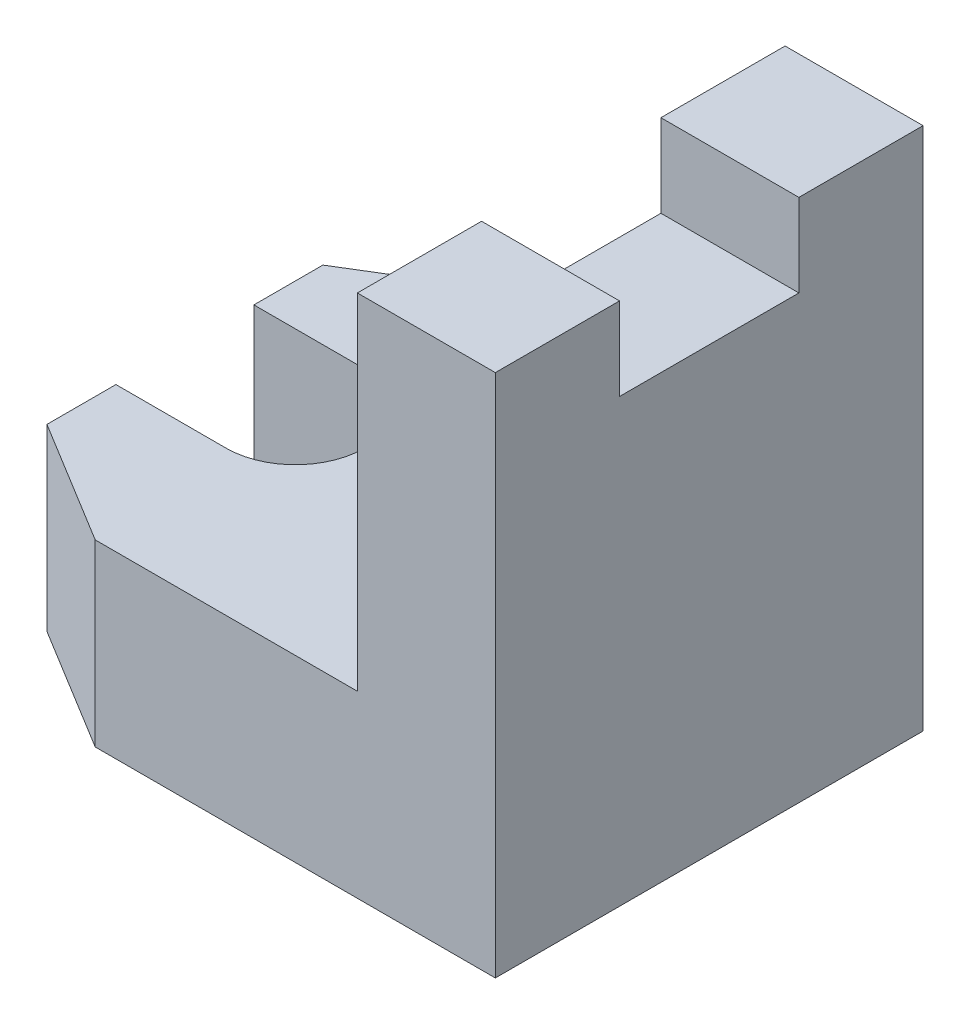
ISO-10303-21;
HEADER;
FILE_DESCRIPTION(('STEP AP214'),'2;1');
FILE_NAME('part.step','',(''),(''),'','','');
FILE_SCHEMA(('AUTOMOTIVE_DESIGN { 1 0 10303 214 1 1 1 1 }'));
ENDSEC;
DATA;
#1=APPLICATION_CONTEXT('core data for automotive mechanical design processes');
#2=APPLICATION_PROTOCOL_DEFINITION('international standard','automotive_design',2000,#1);
#3=PRODUCT_CONTEXT('',#1,'mechanical');
#4=PRODUCT('Part','Part','',(#3));
#5=PRODUCT_RELATED_PRODUCT_CATEGORY('part','',(#4));
#6=PRODUCT_DEFINITION_FORMATION('','',#4);
#7=PRODUCT_DEFINITION_CONTEXT('part definition',#1,'design');
#8=PRODUCT_DEFINITION('design','',#6,#7);
#9=PRODUCT_DEFINITION_SHAPE('','',#8);
#10=(LENGTH_UNIT() NAMED_UNIT(*) SI_UNIT(.MILLI.,.METRE.));
#11=(NAMED_UNIT(*) PLANE_ANGLE_UNIT() SI_UNIT($,.RADIAN.));
#12=(NAMED_UNIT(*) SI_UNIT($,.STERADIAN.) SOLID_ANGLE_UNIT());
#13=UNCERTAINTY_MEASURE_WITH_UNIT(LENGTH_MEASURE(1.E-05),#10,'distance_accuracy_value','');
#14=(GEOMETRIC_REPRESENTATION_CONTEXT(3) GLOBAL_UNCERTAINTY_ASSIGNED_CONTEXT((#13)) GLOBAL_UNIT_ASSIGNED_CONTEXT((#10,
#11,#12)) REPRESENTATION_CONTEXT('',''));
#15=CARTESIAN_POINT('',(0.,0.,0.));
#16=DIRECTION('',(0.,0.,1.));
#17=DIRECTION('',(1.,0.,0.));
#18=AXIS2_PLACEMENT_3D('',#15,#16,#17);
#19=CARTESIAN_POINT('',(0.,38.,0.));
#20=DIRECTION('',(0.,-1.,0.));
#21=DIRECTION('',(0.,0.,-1.));
#22=AXIS2_PLACEMENT_3D('',#19,#20,#21);
#23=PLANE('',#22);
#24=DIRECTION('',(0.,0.,-1.));
#25=VECTOR('',#24,1.);
#26=CARTESIAN_POINT('',(30.,38.,-15.5));
#27=LINE('',#26,#25);
#28=CARTESIAN_POINT('',(30.,38.,15.5));
#29=VERTEX_POINT('',#28);
#30=CARTESIAN_POINT('',(30.,38.,6.5));
#31=VERTEX_POINT('',#30);
#32=EDGE_CURVE('E191',#29,#31,#27,.T.);
#33=ORIENTED_EDGE('',*,*,#32,.T.);
#34=DIRECTION('',(1.,0.,0.));
#35=VECTOR('',#34,1.);
#36=CARTESIAN_POINT('',(20.,38.,6.5));
#37=LINE('',#36,#35);
#38=CARTESIAN_POINT('',(20.,38.,6.5));
#39=VERTEX_POINT('',#38);
#40=EDGE_CURVE('E176',#39,#31,#37,.T.);
#41=ORIENTED_EDGE('',*,*,#40,.F.);
#42=DIRECTION('',(0.,0.,1.));
#43=VECTOR('',#42,1.);
#44=CARTESIAN_POINT('',(20.,38.,-15.5));
#45=LINE('',#44,#43);
#46=CARTESIAN_POINT('',(20.,38.,15.5));
#47=VERTEX_POINT('',#46);
#48=EDGE_CURVE('E198',#39,#47,#45,.T.);
#49=ORIENTED_EDGE('',*,*,#48,.T.);
#50=DIRECTION('',(1.,0.,0.));
#51=VECTOR('',#50,1.);
#52=CARTESIAN_POINT('',(30.,38.,15.5));
#53=LINE('',#52,#51);
#54=EDGE_CURVE('E203',#47,#29,#53,.T.);
#55=ORIENTED_EDGE('',*,*,#54,.T.);
#56=EDGE_LOOP('',(#33,#41,#49,#55));
#57=FACE_BOUND('',#56,.T.);
#58=ADVANCED_FACE('F45',(#57),#23,.F.);
#59=CARTESIAN_POINT('',(0.,13.,0.));
#60=DIRECTION('',(0.,-1.,0.));
#61=DIRECTION('',(0.,0.,-1.));
#62=AXIS2_PLACEMENT_3D('',#59,#60,#61);
#63=CYLINDRICAL_SURFACE('',#62,5.);
#64=CARTESIAN_POINT('',(0.,0.,0.));
#65=DIRECTION('',(0.,-1.,0.));
#66=DIRECTION('',(0.,0.,1.));
#67=AXIS2_PLACEMENT_3D('',#64,#65,#66);
#68=CIRCLE('',#67,5.);
#69=CARTESIAN_POINT('',(0.,0.,-5.));
#70=VERTEX_POINT('',#69);
#71=CARTESIAN_POINT('',(0.,0.,5.));
#72=VERTEX_POINT('',#71);
#73=EDGE_CURVE('E218',#70,#72,#68,.T.);
#74=ORIENTED_EDGE('',*,*,#73,.T.);
#75=DIRECTION('',(0.,-1.,0.));
#76=VECTOR('',#75,1.);
#77=CARTESIAN_POINT('',(0.,13.,5.));
#78=LINE('',#77,#76);
#79=CARTESIAN_POINT('',(0.,13.,5.));
#80=VERTEX_POINT('',#79);
#81=EDGE_CURVE('E11',#80,#72,#78,.T.);
#82=ORIENTED_EDGE('',*,*,#81,.F.);
#83=CARTESIAN_POINT('',(0.,13.,0.));
#84=DIRECTION('',(0.,-1.,0.));
#85=DIRECTION('',(0.,0.,1.));
#86=AXIS2_PLACEMENT_3D('',#83,#84,#85);
#87=CIRCLE('',#86,5.);
#88=CARTESIAN_POINT('',(0.,13.,-5.));
#89=VERTEX_POINT('',#88);
#90=EDGE_CURVE('E219',#89,#80,#87,.T.);
#91=ORIENTED_EDGE('',*,*,#90,.F.);
#92=DIRECTION('',(0.,-1.,0.));
#93=VECTOR('',#92,1.);
#94=CARTESIAN_POINT('',(0.,13.,-5.));
#95=LINE('',#94,#93);
#96=EDGE_CURVE('E248',#89,#70,#95,.T.);
#97=ORIENTED_EDGE('',*,*,#96,.T.);
#98=EDGE_LOOP('',(#74,#82,#91,#97));
#99=FACE_BOUND('',#98,.T.);
#100=ADVANCED_FACE('F47',(#99),#63,.F.);
#101=CARTESIAN_POINT('',(0.,13.,5.));
#102=DIRECTION('',(0.,0.,1.));
#103=DIRECTION('',(1.,0.,0.));
#104=AXIS2_PLACEMENT_3D('',#101,#102,#103);
#105=PLANE('',#104);
#106=DIRECTION('',(-1.,0.,0.));
#107=VECTOR('',#106,1.);
#108=CARTESIAN_POINT('',(0.,0.,5.));
#109=LINE('',#108,#107);
#110=CARTESIAN_POINT('',(-8.,0.,5.));
#111=VERTEX_POINT('',#110);
#112=EDGE_CURVE('E252',#72,#111,#109,.T.);
#113=ORIENTED_EDGE('',*,*,#112,.T.);
#114=DIRECTION('',(0.,-1.,0.));
#115=VECTOR('',#114,1.);
#116=CARTESIAN_POINT('',(-8.,13.,5.));
#117=LINE('',#116,#115);
#118=CARTESIAN_POINT('',(-8.,13.,5.));
#119=VERTEX_POINT('',#118);
#120=EDGE_CURVE('E54',#119,#111,#117,.T.);
#121=ORIENTED_EDGE('',*,*,#120,.F.);
#122=DIRECTION('',(-1.,0.,0.));
#123=VECTOR('',#122,1.);
#124=CARTESIAN_POINT('',(0.,13.,5.));
#125=LINE('',#124,#123);
#126=EDGE_CURVE('E223',#80,#119,#125,.T.);
#127=ORIENTED_EDGE('',*,*,#126,.F.);
#128=ORIENTED_EDGE('',*,*,#81,.T.);
#129=EDGE_LOOP('',(#113,#121,#127,#128));
#130=FACE_BOUND('',#129,.T.);
#131=ADVANCED_FACE('F360',(#130),#105,.F.);
#132=CARTESIAN_POINT('',(-8.,13.,5.));
#133=DIRECTION('',(1.,0.,0.));
#134=DIRECTION('',(0.,0.,-1.));
#135=AXIS2_PLACEMENT_3D('',#132,#133,#134);
#136=PLANE('',#135);
#137=DIRECTION('',(0.,0.,1.));
#138=VECTOR('',#137,1.);
#139=CARTESIAN_POINT('',(-8.,0.,5.));
#140=LINE('',#139,#138);
#141=CARTESIAN_POINT('',(-8.00000000000001,0.,10.));
#142=VERTEX_POINT('',#141);
#143=EDGE_CURVE('E255',#111,#142,#140,.T.);
#144=ORIENTED_EDGE('',*,*,#143,.T.);
#145=DIRECTION('',(0.,-1.,0.));
#146=VECTOR('',#145,1.);
#147=CARTESIAN_POINT('',(-8.00000000000001,13.,10.));
#148=LINE('',#147,#146);
#149=CARTESIAN_POINT('',(-8.00000000000001,13.,10.));
#150=VERTEX_POINT('',#149);
#151=EDGE_CURVE('E305',#150,#142,#148,.T.);
#152=ORIENTED_EDGE('',*,*,#151,.F.);
#153=DIRECTION('',(0.,0.,1.));
#154=VECTOR('',#153,1.);
#155=CARTESIAN_POINT('',(-8.,13.,5.));
#156=LINE('',#155,#154);
#157=EDGE_CURVE('E227',#119,#150,#156,.T.);
#158=ORIENTED_EDGE('',*,*,#157,.F.);
#159=ORIENTED_EDGE('',*,*,#120,.T.);
#160=EDGE_LOOP('',(#144,#152,#158,#159));
#161=FACE_BOUND('',#160,.T.);
#162=ADVANCED_FACE('F314',(#161),#136,.F.);
#163=CARTESIAN_POINT('',(-8.00000000000001,13.,10.));
#164=DIRECTION('',(0.521450009453975,0.,-0.853281833651959));
#165=DIRECTION('',(-0.853281833651959,0.,-0.521450009453975));
#166=AXIS2_PLACEMENT_3D('',#163,#164,#165);
#167=PLANE('',#166);
#168=DIRECTION('',(0.853281833651959,0.,0.521450009453975));
#169=VECTOR('',#168,1.);
#170=CARTESIAN_POINT('',(-8.00000000000001,0.,10.));
#171=LINE('',#170,#169);
#172=CARTESIAN_POINT('',(0.999999999999997,0.,15.5));
#173=VERTEX_POINT('',#172);
#174=EDGE_CURVE('E258',#142,#173,#171,.T.);
#175=ORIENTED_EDGE('',*,*,#174,.T.);
#176=DIRECTION('',(0.,-1.,0.));
#177=VECTOR('',#176,1.);
#178=CARTESIAN_POINT('',(0.999999999999997,13.,15.5));
#179=LINE('',#178,#177);
#180=CARTESIAN_POINT('',(0.999999999999997,13.,15.5));
#181=VERTEX_POINT('',#180);
#182=EDGE_CURVE('E301',#181,#173,#179,.T.);
#183=ORIENTED_EDGE('',*,*,#182,.F.);
#184=DIRECTION('',(0.853281833651959,0.,0.521450009453975));
#185=VECTOR('',#184,1.);
#186=CARTESIAN_POINT('',(-8.00000000000001,13.,10.));
#187=LINE('',#186,#185);
#188=EDGE_CURVE('E230',#150,#181,#187,.T.);
#189=ORIENTED_EDGE('',*,*,#188,.F.);
#190=ORIENTED_EDGE('',*,*,#151,.T.);
#191=EDGE_LOOP('',(#175,#183,#189,#190));
#192=FACE_BOUND('',#191,.T.);
#193=ADVANCED_FACE('F325',(#192),#167,.F.);
#194=CARTESIAN_POINT('',(0.999999999999997,13.,15.5));
#195=DIRECTION('',(0.,0.,-1.));
#196=DIRECTION('',(-1.,0.,0.));
#197=AXIS2_PLACEMENT_3D('',#194,#195,#196);
#198=PLANE('',#197);
#199=DIRECTION('',(1.,0.,0.));
#200=VECTOR('',#199,1.);
#201=CARTESIAN_POINT('',(0.999999999999997,0.,15.5));
#202=LINE('',#201,#200);
#203=CARTESIAN_POINT('',(30.,0.,15.5));
#204=VERTEX_POINT('',#203);
#205=EDGE_CURVE('E261',#173,#204,#202,.T.);
#206=ORIENTED_EDGE('',*,*,#205,.T.);
#207=DIRECTION('',(0.,-1.,0.));
#208=VECTOR('',#207,1.);
#209=CARTESIAN_POINT('',(30.,13.,15.5));
#210=LINE('',#209,#208);
#211=EDGE_CURVE('E297',#29,#204,#210,.T.);
#212=ORIENTED_EDGE('',*,*,#211,.F.);
#213=ORIENTED_EDGE('',*,*,#54,.F.);
#214=DIRECTION('',(0.,-1.,0.));
#215=VECTOR('',#214,1.);
#216=CARTESIAN_POINT('',(20.,38.,15.5));
#217=LINE('',#216,#215);
#218=CARTESIAN_POINT('',(20.,13.,15.5));
#219=VERTEX_POINT('',#218);
#220=EDGE_CURVE('E207',#47,#219,#217,.T.);
#221=ORIENTED_EDGE('',*,*,#220,.T.);
#222=DIRECTION('',(1.,0.,0.));
#223=VECTOR('',#222,1.);
#224=CARTESIAN_POINT('',(0.999999999999997,13.,15.5));
#225=LINE('',#224,#223);
#226=EDGE_CURVE('E233',#181,#219,#225,.T.);
#227=ORIENTED_EDGE('',*,*,#226,.F.);
#228=ORIENTED_EDGE('',*,*,#182,.T.);
#229=EDGE_LOOP('',(#206,#212,#213,#221,#227,#228));
#230=FACE_BOUND('',#229,.T.);
#231=ADVANCED_FACE('F329',(#230),#198,.F.);
#232=CARTESIAN_POINT('',(30.,13.,-15.5));
#233=DIRECTION('',(-1.,0.,0.));
#234=DIRECTION('',(0.,0.,1.));
#235=AXIS2_PLACEMENT_3D('',#232,#233,#234);
#236=PLANE('',#235);
#237=DIRECTION('',(0.,0.,-1.));
#238=VECTOR('',#237,1.);
#239=CARTESIAN_POINT('',(30.,32.,6.5));
#240=LINE('',#239,#238);
#241=CARTESIAN_POINT('',(30.,32.,6.5));
#242=VERTEX_POINT('',#241);
#243=CARTESIAN_POINT('',(30.,32.,-6.5));
#244=VERTEX_POINT('',#243);
#245=EDGE_CURVE('E166',#242,#244,#240,.T.);
#246=ORIENTED_EDGE('',*,*,#245,.F.);
#247=DIRECTION('',(0.,1.,0.));
#248=VECTOR('',#247,1.);
#249=CARTESIAN_POINT('',(30.,32.,6.5));
#250=LINE('',#249,#248);
#251=EDGE_CURVE('E210',#242,#31,#250,.T.);
#252=ORIENTED_EDGE('',*,*,#251,.T.);
#253=ORIENTED_EDGE('',*,*,#32,.F.);
#254=ORIENTED_EDGE('',*,*,#211,.T.);
#255=DIRECTION('',(0.,0.,-1.));
#256=VECTOR('',#255,1.);
#257=CARTESIAN_POINT('',(30.,0.,-15.5));
#258=LINE('',#257,#256);
#259=CARTESIAN_POINT('',(30.,0.,-15.5));
#260=VERTEX_POINT('',#259);
#261=EDGE_CURVE('E264',#204,#260,#258,.T.);
#262=ORIENTED_EDGE('',*,*,#261,.T.);
#263=DIRECTION('',(0.,-1.,0.));
#264=VECTOR('',#263,1.);
#265=CARTESIAN_POINT('',(30.,13.,-15.5));
#266=LINE('',#265,#264);
#267=CARTESIAN_POINT('',(30.,38.,-15.5));
#268=VERTEX_POINT('',#267);
#269=EDGE_CURVE('E293',#268,#260,#266,.T.);
#270=ORIENTED_EDGE('',*,*,#269,.F.);
#271=CARTESIAN_POINT('',(30.,38.,-6.5));
#272=VERTEX_POINT('',#271);
#273=EDGE_CURVE('E181',#272,#268,#27,.T.);
#274=ORIENTED_EDGE('',*,*,#273,.F.);
#275=DIRECTION('',(0.,1.,0.));
#276=VECTOR('',#275,1.);
#277=CARTESIAN_POINT('',(30.,32.,-6.5));
#278=LINE('',#277,#276);
#279=EDGE_CURVE('E61',#244,#272,#278,.T.);
#280=ORIENTED_EDGE('',*,*,#279,.F.);
#281=EDGE_LOOP('',(#246,#252,#253,#254,#262,#270,#274,#280));
#282=FACE_BOUND('',#281,.T.);
#283=ADVANCED_FACE('F179',(#282),#236,.F.);
#284=CARTESIAN_POINT('',(0.999999999999997,13.,-15.5));
#285=DIRECTION('',(0.,0.,1.));
#286=DIRECTION('',(1.,0.,0.));
#287=AXIS2_PLACEMENT_3D('',#284,#285,#286);
#288=PLANE('',#287);
#289=DIRECTION('',(-1.,0.,0.));
#290=VECTOR('',#289,1.);
#291=CARTESIAN_POINT('',(0.999999999999997,0.,-15.5));
#292=LINE('',#291,#290);
#293=CARTESIAN_POINT('',(0.999999999999997,0.,-15.5));
#294=VERTEX_POINT('',#293);
#295=EDGE_CURVE('E267',#260,#294,#292,.T.);
#296=ORIENTED_EDGE('',*,*,#295,.T.);
#297=DIRECTION('',(0.,-1.,0.));
#298=VECTOR('',#297,1.);
#299=CARTESIAN_POINT('',(0.999999999999997,13.,-15.5));
#300=LINE('',#299,#298);
#301=CARTESIAN_POINT('',(0.999999999999997,13.,-15.5));
#302=VERTEX_POINT('',#301);
#303=EDGE_CURVE('E289',#302,#294,#300,.T.);
#304=ORIENTED_EDGE('',*,*,#303,.F.);
#305=DIRECTION('',(-1.,0.,0.));
#306=VECTOR('',#305,1.);
#307=CARTESIAN_POINT('',(0.999999999999997,13.,-15.5));
#308=LINE('',#307,#306);
#309=CARTESIAN_POINT('',(20.,13.,-15.5));
#310=VERTEX_POINT('',#309);
#311=EDGE_CURVE('E236',#310,#302,#308,.T.);
#312=ORIENTED_EDGE('',*,*,#311,.F.);
#313=DIRECTION('',(0.,-1.,0.));
#314=VECTOR('',#313,1.);
#315=CARTESIAN_POINT('',(20.,38.,-15.5));
#316=LINE('',#315,#314);
#317=CARTESIAN_POINT('',(20.,38.,-15.5));
#318=VERTEX_POINT('',#317);
#319=EDGE_CURVE('E214',#318,#310,#316,.T.);
#320=ORIENTED_EDGE('',*,*,#319,.F.);
#321=DIRECTION('',(-1.,0.,0.));
#322=VECTOR('',#321,1.);
#323=CARTESIAN_POINT('',(30.,38.,-15.5));
#324=LINE('',#323,#322);
#325=EDGE_CURVE('E195',#268,#318,#324,.T.);
#326=ORIENTED_EDGE('',*,*,#325,.F.);
#327=ORIENTED_EDGE('',*,*,#269,.T.);
#328=EDGE_LOOP('',(#296,#304,#312,#320,#326,#327));
#329=FACE_BOUND('',#328,.T.);
#330=ADVANCED_FACE('F340',(#329),#288,.F.);
#331=CARTESIAN_POINT('',(-8.00000000000001,13.,-10.));
#332=DIRECTION('',(0.521450009453975,0.,0.853281833651959));
#333=DIRECTION('',(0.853281833651959,0.,-0.521450009453975));
#334=AXIS2_PLACEMENT_3D('',#331,#332,#333);
#335=PLANE('',#334);
#336=DIRECTION('',(-0.853281833651959,0.,0.521450009453975));
#337=VECTOR('',#336,1.);
#338=CARTESIAN_POINT('',(-8.00000000000001,0.,-10.));
#339=LINE('',#338,#337);
#340=CARTESIAN_POINT('',(-8.00000000000001,0.,-10.));
#341=VERTEX_POINT('',#340);
#342=EDGE_CURVE('E270',#294,#341,#339,.T.);
#343=ORIENTED_EDGE('',*,*,#342,.T.);
#344=DIRECTION('',(0.,-1.,0.));
#345=VECTOR('',#344,1.);
#346=CARTESIAN_POINT('',(-8.00000000000001,13.,-10.));
#347=LINE('',#346,#345);
#348=CARTESIAN_POINT('',(-8.00000000000001,13.,-10.));
#349=VERTEX_POINT('',#348);
#350=EDGE_CURVE('E285',#349,#341,#347,.T.);
#351=ORIENTED_EDGE('',*,*,#350,.F.);
#352=DIRECTION('',(-0.853281833651959,0.,0.521450009453975));
#353=VECTOR('',#352,1.);
#354=CARTESIAN_POINT('',(-8.00000000000001,13.,-10.));
#355=LINE('',#354,#353);
#356=EDGE_CURVE('E239',#302,#349,#355,.T.);
#357=ORIENTED_EDGE('',*,*,#356,.F.);
#358=ORIENTED_EDGE('',*,*,#303,.T.);
#359=EDGE_LOOP('',(#343,#351,#357,#358));
#360=FACE_BOUND('',#359,.T.);
#361=ADVANCED_FACE('F347',(#360),#335,.F.);
#362=CARTESIAN_POINT('',(-8.,13.,-5.));
#363=DIRECTION('',(1.,0.,0.));
#364=DIRECTION('',(0.,0.,-1.));
#365=AXIS2_PLACEMENT_3D('',#362,#363,#364);
#366=PLANE('',#365);
#367=DIRECTION('',(0.,0.,1.));
#368=VECTOR('',#367,1.);
#369=CARTESIAN_POINT('',(-8.,0.,-5.));
#370=LINE('',#369,#368);
#371=CARTESIAN_POINT('',(-8.,0.,-5.));
#372=VERTEX_POINT('',#371);
#373=EDGE_CURVE('E273',#341,#372,#370,.T.);
#374=ORIENTED_EDGE('',*,*,#373,.T.);
#375=DIRECTION('',(0.,-1.,0.));
#376=VECTOR('',#375,1.);
#377=CARTESIAN_POINT('',(-8.,13.,-5.));
#378=LINE('',#377,#376);
#379=CARTESIAN_POINT('',(-8.,13.,-5.));
#380=VERTEX_POINT('',#379);
#381=EDGE_CURVE('E281',#380,#372,#378,.T.);
#382=ORIENTED_EDGE('',*,*,#381,.F.);
#383=DIRECTION('',(0.,0.,1.));
#384=VECTOR('',#383,1.);
#385=CARTESIAN_POINT('',(-8.,13.,-5.));
#386=LINE('',#385,#384);
#387=EDGE_CURVE('E242',#349,#380,#386,.T.);
#388=ORIENTED_EDGE('',*,*,#387,.F.);
#389=ORIENTED_EDGE('',*,*,#350,.T.);
#390=EDGE_LOOP('',(#374,#382,#388,#389));
#391=FACE_BOUND('',#390,.T.);
#392=ADVANCED_FACE('F351',(#391),#366,.F.);
#393=CARTESIAN_POINT('',(0.,13.,-5.));
#394=DIRECTION('',(0.,0.,-1.));
#395=DIRECTION('',(-1.,0.,0.));
#396=AXIS2_PLACEMENT_3D('',#393,#394,#395);
#397=PLANE('',#396);
#398=DIRECTION('',(1.,0.,0.));
#399=VECTOR('',#398,1.);
#400=CARTESIAN_POINT('',(0.,0.,-5.));
#401=LINE('',#400,#399);
#402=EDGE_CURVE('E224',#372,#70,#401,.T.);
#403=ORIENTED_EDGE('',*,*,#402,.T.);
#404=ORIENTED_EDGE('',*,*,#96,.F.);
#405=DIRECTION('',(1.,0.,0.));
#406=VECTOR('',#405,1.);
#407=CARTESIAN_POINT('',(0.,13.,-5.));
#408=LINE('',#407,#406);
#409=EDGE_CURVE('E245',#380,#89,#408,.T.);
#410=ORIENTED_EDGE('',*,*,#409,.F.);
#411=ORIENTED_EDGE('',*,*,#381,.T.);
#412=EDGE_LOOP('',(#403,#404,#410,#411));
#413=FACE_BOUND('',#412,.T.);
#414=ADVANCED_FACE('F356',(#413),#397,.F.);
#415=CARTESIAN_POINT('',(0.,13.,0.));
#416=DIRECTION('',(0.,1.,0.));
#417=DIRECTION('',(0.,0.,1.));
#418=AXIS2_PLACEMENT_3D('',#415,#416,#417);
#419=PLANE('',#418);
#420=DIRECTION('',(0.,0.,1.));
#421=VECTOR('',#420,1.);
#422=CARTESIAN_POINT('',(20.,13.,-15.5));
#423=LINE('',#422,#421);
#424=EDGE_CURVE('E69',#310,#219,#423,.T.);
#425=ORIENTED_EDGE('',*,*,#424,.F.);
#426=ORIENTED_EDGE('',*,*,#311,.T.);
#427=ORIENTED_EDGE('',*,*,#356,.T.);
#428=ORIENTED_EDGE('',*,*,#387,.T.);
#429=ORIENTED_EDGE('',*,*,#409,.T.);
#430=ORIENTED_EDGE('',*,*,#90,.T.);
#431=ORIENTED_EDGE('',*,*,#126,.T.);
#432=ORIENTED_EDGE('',*,*,#157,.T.);
#433=ORIENTED_EDGE('',*,*,#188,.T.);
#434=ORIENTED_EDGE('',*,*,#226,.T.);
#435=EDGE_LOOP('',(#425,#426,#427,#428,#429,#430,#431,#432,#433,#434));
#436=FACE_BOUND('',#435,.T.);
#437=ADVANCED_FACE('F332',(#436),#419,.T.);
#438=CARTESIAN_POINT('',(0.,0.,0.));
#439=DIRECTION('',(0.,1.,0.));
#440=DIRECTION('',(0.,0.,1.));
#441=AXIS2_PLACEMENT_3D('',#438,#439,#440);
#442=PLANE('',#441);
#443=ORIENTED_EDGE('',*,*,#73,.F.);
#444=ORIENTED_EDGE('',*,*,#402,.F.);
#445=ORIENTED_EDGE('',*,*,#373,.F.);
#446=ORIENTED_EDGE('',*,*,#342,.F.);
#447=ORIENTED_EDGE('',*,*,#295,.F.);
#448=ORIENTED_EDGE('',*,*,#261,.F.);
#449=ORIENTED_EDGE('',*,*,#205,.F.);
#450=ORIENTED_EDGE('',*,*,#174,.F.);
#451=ORIENTED_EDGE('',*,*,#143,.F.);
#452=ORIENTED_EDGE('',*,*,#112,.F.);
#453=EDGE_LOOP('',(#443,#444,#445,#446,#447,#448,#449,#450,#451,#452));
#454=FACE_BOUND('',#453,.T.);
#455=ADVANCED_FACE('F320',(#454),#442,.F.);
#456=CARTESIAN_POINT('',(20.,38.,-15.5));
#457=DIRECTION('',(1.,0.,0.));
#458=DIRECTION('',(0.,0.,-1.));
#459=AXIS2_PLACEMENT_3D('',#456,#457,#458);
#460=PLANE('',#459);
#461=ORIENTED_EDGE('',*,*,#48,.F.);
#462=DIRECTION('',(0.,1.,0.));
#463=VECTOR('',#462,1.);
#464=CARTESIAN_POINT('',(20.,32.,6.5));
#465=LINE('',#464,#463);
#466=CARTESIAN_POINT('',(20.,32.,6.5));
#467=VERTEX_POINT('',#466);
#468=EDGE_CURVE('E186',#467,#39,#465,.T.);
#469=ORIENTED_EDGE('',*,*,#468,.F.);
#470=DIRECTION('',(0.,0.,1.));
#471=VECTOR('',#470,1.);
#472=CARTESIAN_POINT('',(20.,32.,6.5));
#473=LINE('',#472,#471);
#474=CARTESIAN_POINT('',(20.,32.,-6.5));
#475=VERTEX_POINT('',#474);
#476=EDGE_CURVE('E165',#475,#467,#473,.T.);
#477=ORIENTED_EDGE('',*,*,#476,.F.);
#478=DIRECTION('',(0.,1.,0.));
#479=VECTOR('',#478,1.);
#480=CARTESIAN_POINT('',(20.,32.,-6.5));
#481=LINE('',#480,#479);
#482=CARTESIAN_POINT('',(20.,38.,-6.5));
#483=VERTEX_POINT('',#482);
#484=EDGE_CURVE('E161',#475,#483,#481,.T.);
#485=ORIENTED_EDGE('',*,*,#484,.T.);
#486=EDGE_CURVE('E199',#318,#483,#45,.T.);
#487=ORIENTED_EDGE('',*,*,#486,.F.);
#488=ORIENTED_EDGE('',*,*,#319,.T.);
#489=ORIENTED_EDGE('',*,*,#424,.T.);
#490=ORIENTED_EDGE('',*,*,#220,.F.);
#491=EDGE_LOOP('',(#461,#469,#477,#485,#487,#488,#489,#490));
#492=FACE_BOUND('',#491,.T.);
#493=ADVANCED_FACE('F335',(#492),#460,.F.);
#494=ORIENTED_EDGE('',*,*,#486,.T.);
#495=DIRECTION('',(-1.,0.,0.));
#496=VECTOR('',#495,1.);
#497=CARTESIAN_POINT('',(20.,38.,-6.5));
#498=LINE('',#497,#496);
#499=EDGE_CURVE('E386',#272,#483,#498,.T.);
#500=ORIENTED_EDGE('',*,*,#499,.F.);
#501=ORIENTED_EDGE('',*,*,#273,.T.);
#502=ORIENTED_EDGE('',*,*,#325,.T.);
#503=EDGE_LOOP('',(#494,#500,#501,#502));
#504=FACE_BOUND('',#503,.T.);
#505=ADVANCED_FACE('F370',(#504),#23,.F.);
#506=CARTESIAN_POINT('',(20.,32.,6.5));
#507=DIRECTION('',(0.,0.,1.));
#508=DIRECTION('',(1.,0.,0.));
#509=AXIS2_PLACEMENT_3D('',#506,#507,#508);
#510=PLANE('',#509);
#511=ORIENTED_EDGE('',*,*,#40,.T.);
#512=ORIENTED_EDGE('',*,*,#251,.F.);
#513=DIRECTION('',(1.,0.,0.));
#514=VECTOR('',#513,1.);
#515=CARTESIAN_POINT('',(20.,32.,6.5));
#516=LINE('',#515,#514);
#517=EDGE_CURVE('E172',#467,#242,#516,.T.);
#518=ORIENTED_EDGE('',*,*,#517,.F.);
#519=ORIENTED_EDGE('',*,*,#468,.T.);
#520=EDGE_LOOP('',(#511,#512,#518,#519));
#521=FACE_BOUND('',#520,.T.);
#522=ADVANCED_FACE('F378',(#521),#510,.F.);
#523=CARTESIAN_POINT('',(20.,32.,-6.5));
#524=DIRECTION('',(0.,0.,-1.));
#525=DIRECTION('',(-1.,0.,0.));
#526=AXIS2_PLACEMENT_3D('',#523,#524,#525);
#527=PLANE('',#526);
#528=ORIENTED_EDGE('',*,*,#499,.T.);
#529=ORIENTED_EDGE('',*,*,#484,.F.);
#530=DIRECTION('',(-1.,0.,0.));
#531=VECTOR('',#530,1.);
#532=CARTESIAN_POINT('',(20.,32.,-6.5));
#533=LINE('',#532,#531);
#534=EDGE_CURVE('E157',#244,#475,#533,.T.);
#535=ORIENTED_EDGE('',*,*,#534,.F.);
#536=ORIENTED_EDGE('',*,*,#279,.T.);
#537=EDGE_LOOP('',(#528,#529,#535,#536));
#538=FACE_BOUND('',#537,.T.);
#539=ADVANCED_FACE('F159',(#538),#527,.F.);
#540=CARTESIAN_POINT('',(0.,32.,0.));
#541=DIRECTION('',(0.,-1.,0.));
#542=DIRECTION('',(0.,0.,-1.));
#543=AXIS2_PLACEMENT_3D('',#540,#541,#542);
#544=PLANE('',#543);
#545=ORIENTED_EDGE('',*,*,#245,.T.);
#546=ORIENTED_EDGE('',*,*,#534,.T.);
#547=ORIENTED_EDGE('',*,*,#476,.T.);
#548=ORIENTED_EDGE('',*,*,#517,.T.);
#549=EDGE_LOOP('',(#545,#546,#547,#548));
#550=FACE_BOUND('',#549,.T.);
#551=ADVANCED_FACE('F170',(#550),#544,.F.);
#552=CLOSED_SHELL('',(#58,#100,#131,#162,#193,#231,#283,#330,#361,#392,#414,#437,#455,#493,#505,
#522,#539,#551));
#553=MANIFOLD_SOLID_BREP('B2',#552);
#554=ADVANCED_BREP_SHAPE_REPRESENTATION('',(#18,#553),#14);
#555=SHAPE_DEFINITION_REPRESENTATION(#9,#554);
ENDSEC;
END-ISO-10303-21;
